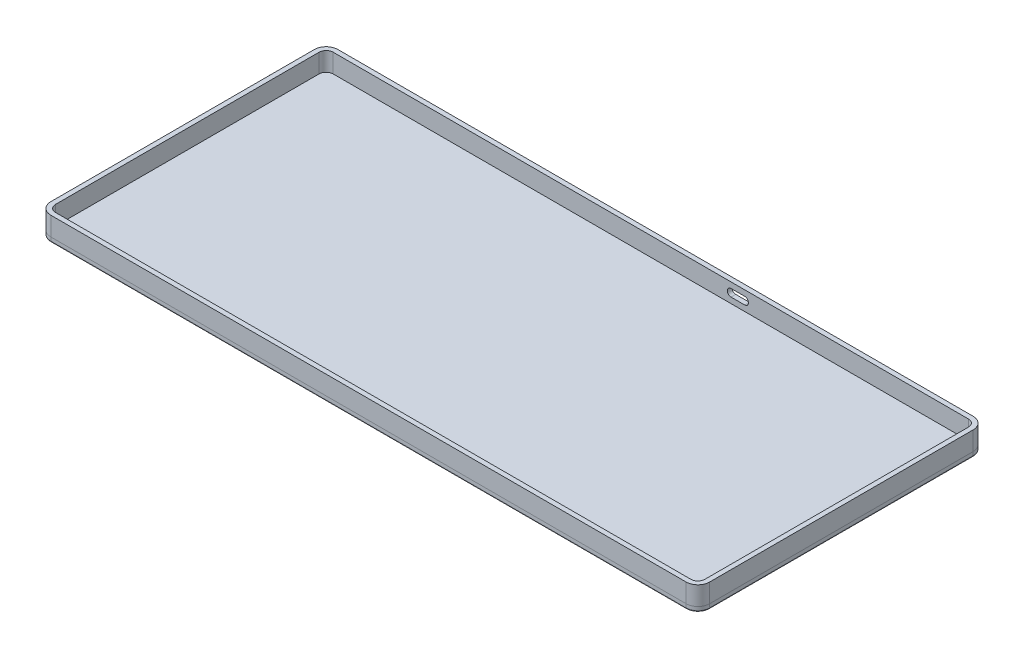
ISO-10303-21;
HEADER;
FILE_DESCRIPTION(('STEP AP214'),'2;1');
FILE_NAME('part.step','',(''),(''),'','','');
FILE_SCHEMA(('AUTOMOTIVE_DESIGN { 1 0 10303 214 1 1 1 1 }'));
ENDSEC;
DATA;
#1=APPLICATION_CONTEXT('core data for automotive mechanical design processes');
#2=APPLICATION_PROTOCOL_DEFINITION('international standard','automotive_design',2000,#1);
#3=PRODUCT_CONTEXT('',#1,'mechanical');
#4=PRODUCT('Part','Part','',(#3));
#5=PRODUCT_RELATED_PRODUCT_CATEGORY('part','',(#4));
#6=PRODUCT_DEFINITION_FORMATION('','',#4);
#7=PRODUCT_DEFINITION_CONTEXT('part definition',#1,'design');
#8=PRODUCT_DEFINITION('design','',#6,#7);
#9=PRODUCT_DEFINITION_SHAPE('','',#8);
#10=(LENGTH_UNIT() NAMED_UNIT(*) SI_UNIT(.MILLI.,.METRE.));
#11=(NAMED_UNIT(*) PLANE_ANGLE_UNIT() SI_UNIT($,.RADIAN.));
#12=(NAMED_UNIT(*) SI_UNIT($,.STERADIAN.) SOLID_ANGLE_UNIT());
#13=UNCERTAINTY_MEASURE_WITH_UNIT(LENGTH_MEASURE(1.E-05),#10,'distance_accuracy_value','');
#14=(GEOMETRIC_REPRESENTATION_CONTEXT(3) GLOBAL_UNCERTAINTY_ASSIGNED_CONTEXT((#13)) GLOBAL_UNIT_ASSIGNED_CONTEXT((#10,
#11,#12)) REPRESENTATION_CONTEXT('',''));
#15=CARTESIAN_POINT('',(0.,0.,0.));
#16=DIRECTION('',(0.,0.,1.));
#17=DIRECTION('',(1.,0.,0.));
#18=AXIS2_PLACEMENT_3D('',#15,#16,#17);
#19=CARTESIAN_POINT('',(135.,10.,-56.));
#20=DIRECTION('',(0.,1.,0.));
#21=DIRECTION('',(0.,0.,1.));
#22=AXIS2_PLACEMENT_3D('',#19,#20,#21);
#23=PLANE('',#22);
#24=CARTESIAN_POINT('',(135.,10.,-56.));
#25=DIRECTION('',(0.,1.,0.));
#26=DIRECTION('',(0.,0.,1.));
#27=AXIS2_PLACEMENT_3D('',#24,#25,#26);
#28=CIRCLE('',#27,5.);
#29=CARTESIAN_POINT('',(140.,10.,-56.));
#30=VERTEX_POINT('',#29);
#31=CARTESIAN_POINT('',(135.,10.,-61.));
#32=VERTEX_POINT('',#31);
#33=EDGE_CURVE('E276',#30,#32,#28,.T.);
#34=ORIENTED_EDGE('',*,*,#33,.T.);
#35=DIRECTION('',(-1.,0.,0.));
#36=VECTOR('',#35,1.);
#37=CARTESIAN_POINT('',(135.,10.,-61.));
#38=LINE('',#37,#36);
#39=CARTESIAN_POINT('',(-135.,10.,-61.));
#40=VERTEX_POINT('',#39);
#41=EDGE_CURVE('E279',#32,#40,#38,.T.);
#42=ORIENTED_EDGE('',*,*,#41,.T.);
#43=CARTESIAN_POINT('',(-135.,10.,-56.));
#44=DIRECTION('',(0.,1.,0.));
#45=DIRECTION('',(0.,0.,1.));
#46=AXIS2_PLACEMENT_3D('',#43,#44,#45);
#47=CIRCLE('',#46,5.);
#48=CARTESIAN_POINT('',(-140.,10.,-56.));
#49=VERTEX_POINT('',#48);
#50=EDGE_CURVE('E282',#40,#49,#47,.T.);
#51=ORIENTED_EDGE('',*,*,#50,.T.);
#52=DIRECTION('',(0.,0.,1.));
#53=VECTOR('',#52,1.);
#54=CARTESIAN_POINT('',(-140.,10.,-56.));
#55=LINE('',#54,#53);
#56=CARTESIAN_POINT('',(-140.,10.,56.));
#57=VERTEX_POINT('',#56);
#58=EDGE_CURVE('E284',#49,#57,#55,.T.);
#59=ORIENTED_EDGE('',*,*,#58,.T.);
#60=CARTESIAN_POINT('',(-135.,10.,56.));
#61=DIRECTION('',(0.,1.,0.));
#62=DIRECTION('',(0.,0.,1.));
#63=AXIS2_PLACEMENT_3D('',#60,#61,#62);
#64=CIRCLE('',#63,4.99999999999998);
#65=CARTESIAN_POINT('',(-135.,10.,61.));
#66=VERTEX_POINT('',#65);
#67=EDGE_CURVE('E286',#57,#66,#64,.T.);
#68=ORIENTED_EDGE('',*,*,#67,.T.);
#69=DIRECTION('',(1.,0.,0.));
#70=VECTOR('',#69,1.);
#71=CARTESIAN_POINT('',(-135.,10.,61.));
#72=LINE('',#71,#70);
#73=CARTESIAN_POINT('',(135.,10.,61.));
#74=VERTEX_POINT('',#73);
#75=EDGE_CURVE('E288',#66,#74,#72,.T.);
#76=ORIENTED_EDGE('',*,*,#75,.T.);
#77=CARTESIAN_POINT('',(135.,10.,56.));
#78=DIRECTION('',(0.,1.,0.));
#79=DIRECTION('',(0.,0.,1.));
#80=AXIS2_PLACEMENT_3D('',#77,#78,#79);
#81=CIRCLE('',#80,5.);
#82=CARTESIAN_POINT('',(140.,10.,56.));
#83=VERTEX_POINT('',#82);
#84=EDGE_CURVE('E290',#74,#83,#81,.T.);
#85=ORIENTED_EDGE('',*,*,#84,.T.);
#86=DIRECTION('',(0.,0.,-1.));
#87=VECTOR('',#86,1.);
#88=CARTESIAN_POINT('',(140.,10.,56.));
#89=LINE('',#88,#87);
#90=EDGE_CURVE('E292',#83,#30,#89,.T.);
#91=ORIENTED_EDGE('',*,*,#90,.T.);
#92=EDGE_LOOP('',(#34,#42,#51,#59,#68,#76,#85,#91));
#93=FACE_BOUND('',#92,.T.);
#94=DIRECTION('',(-1.,0.,0.));
#95=VECTOR('',#94,1.);
#96=CARTESIAN_POINT('',(135.,10.,-59.));
#97=LINE('',#96,#95);
#98=CARTESIAN_POINT('',(135.,10.,-59.));
#99=VERTEX_POINT('',#98);
#100=CARTESIAN_POINT('',(-135.,10.,-58.9999999999999));
#101=VERTEX_POINT('',#100);
#102=EDGE_CURVE('E219',#99,#101,#97,.T.);
#103=ORIENTED_EDGE('',*,*,#102,.F.);
#104=CARTESIAN_POINT('',(135.,10.,-56.));
#105=DIRECTION('',(0.,1.,0.));
#106=DIRECTION('',(0.,0.,1.));
#107=AXIS2_PLACEMENT_3D('',#104,#105,#106);
#108=CIRCLE('',#107,3.);
#109=CARTESIAN_POINT('',(138.,10.,-56.));
#110=VERTEX_POINT('',#109);
#111=EDGE_CURVE('E217',#110,#99,#108,.T.);
#112=ORIENTED_EDGE('',*,*,#111,.F.);
#113=DIRECTION('',(0.,0.,-1.));
#114=VECTOR('',#113,1.);
#115=CARTESIAN_POINT('',(138.,10.,56.));
#116=LINE('',#115,#114);
#117=CARTESIAN_POINT('',(138.,10.,56.));
#118=VERTEX_POINT('',#117);
#119=EDGE_CURVE('E233',#118,#110,#116,.T.);
#120=ORIENTED_EDGE('',*,*,#119,.F.);
#121=CARTESIAN_POINT('',(135.,10.,56.));
#122=DIRECTION('',(0.,1.,0.));
#123=DIRECTION('',(0.,0.,1.));
#124=AXIS2_PLACEMENT_3D('',#121,#122,#123);
#125=CIRCLE('',#124,2.99999999999999);
#126=CARTESIAN_POINT('',(135.,10.,59.));
#127=VERTEX_POINT('',#126);
#128=EDGE_CURVE('E230',#127,#118,#125,.T.);
#129=ORIENTED_EDGE('',*,*,#128,.F.);
#130=DIRECTION('',(1.,0.,0.));
#131=VECTOR('',#130,1.);
#132=CARTESIAN_POINT('',(-135.,10.,59.));
#133=LINE('',#132,#131);
#134=CARTESIAN_POINT('',(-135.,10.,59.));
#135=VERTEX_POINT('',#134);
#136=EDGE_CURVE('E228',#135,#127,#133,.T.);
#137=ORIENTED_EDGE('',*,*,#136,.F.);
#138=CARTESIAN_POINT('',(-135.,10.,56.));
#139=DIRECTION('',(0.,1.,0.));
#140=DIRECTION('',(0.,0.,1.));
#141=AXIS2_PLACEMENT_3D('',#138,#139,#140);
#142=CIRCLE('',#141,2.99999999999994);
#143=CARTESIAN_POINT('',(-138.,10.,56.));
#144=VERTEX_POINT('',#143);
#145=EDGE_CURVE('E226',#144,#135,#142,.T.);
#146=ORIENTED_EDGE('',*,*,#145,.F.);
#147=DIRECTION('',(0.,0.,1.));
#148=VECTOR('',#147,1.);
#149=CARTESIAN_POINT('',(-138.,10.,-56.));
#150=LINE('',#149,#148);
#151=CARTESIAN_POINT('',(-138.,10.,-56.));
#152=VERTEX_POINT('',#151);
#153=EDGE_CURVE('E224',#152,#144,#150,.T.);
#154=ORIENTED_EDGE('',*,*,#153,.F.);
#155=CARTESIAN_POINT('',(-135.,10.,-56.));
#156=DIRECTION('',(0.,1.,0.));
#157=DIRECTION('',(0.,0.,1.));
#158=AXIS2_PLACEMENT_3D('',#155,#156,#157);
#159=CIRCLE('',#158,2.99999999999998);
#160=EDGE_CURVE('E222',#101,#152,#159,.T.);
#161=ORIENTED_EDGE('',*,*,#160,.F.);
#162=EDGE_LOOP('',(#103,#112,#120,#129,#137,#146,#154,#161));
#163=FACE_BOUND('',#162,.T.);
#164=ADVANCED_FACE('F43',(#93,#163),#23,.T.);
#165=CARTESIAN_POINT('',(135.,2.,-56.));
#166=DIRECTION('',(0.,1.,0.));
#167=DIRECTION('',(0.,0.,1.));
#168=AXIS2_PLACEMENT_3D('',#165,#166,#167);
#169=PLANE('',#168);
#170=CARTESIAN_POINT('',(135.,2.,-56.));
#171=DIRECTION('',(0.,1.,0.));
#172=DIRECTION('',(0.,0.,1.));
#173=AXIS2_PLACEMENT_3D('',#170,#171,#172);
#174=CIRCLE('',#173,5.);
#175=CARTESIAN_POINT('',(140.,2.,-56.));
#176=VERTEX_POINT('',#175);
#177=CARTESIAN_POINT('',(135.,2.,-61.));
#178=VERTEX_POINT('',#177);
#179=EDGE_CURVE('E275',#176,#178,#174,.T.);
#180=ORIENTED_EDGE('',*,*,#179,.F.);
#181=DIRECTION('',(0.,0.,-1.));
#182=VECTOR('',#181,1.);
#183=CARTESIAN_POINT('',(140.,2.,56.));
#184=LINE('',#183,#182);
#185=CARTESIAN_POINT('',(140.,2.,56.));
#186=VERTEX_POINT('',#185);
#187=EDGE_CURVE('E280',#186,#176,#184,.T.);
#188=ORIENTED_EDGE('',*,*,#187,.F.);
#189=CARTESIAN_POINT('',(135.,2.,56.));
#190=DIRECTION('',(0.,1.,0.));
#191=DIRECTION('',(0.,0.,1.));
#192=AXIS2_PLACEMENT_3D('',#189,#190,#191);
#193=CIRCLE('',#192,5.);
#194=CARTESIAN_POINT('',(135.,2.,61.));
#195=VERTEX_POINT('',#194);
#196=EDGE_CURVE('E307',#195,#186,#193,.T.);
#197=ORIENTED_EDGE('',*,*,#196,.F.);
#198=DIRECTION('',(1.,0.,0.));
#199=VECTOR('',#198,1.);
#200=CARTESIAN_POINT('',(-135.,2.,61.));
#201=LINE('',#200,#199);
#202=CARTESIAN_POINT('',(-135.,2.,61.));
#203=VERTEX_POINT('',#202);
#204=EDGE_CURVE('E305',#203,#195,#201,.T.);
#205=ORIENTED_EDGE('',*,*,#204,.F.);
#206=CARTESIAN_POINT('',(-135.,2.,56.));
#207=DIRECTION('',(0.,1.,0.));
#208=DIRECTION('',(0.,0.,1.));
#209=AXIS2_PLACEMENT_3D('',#206,#207,#208);
#210=CIRCLE('',#209,4.99999999999998);
#211=CARTESIAN_POINT('',(-140.,2.,56.));
#212=VERTEX_POINT('',#211);
#213=EDGE_CURVE('E303',#212,#203,#210,.T.);
#214=ORIENTED_EDGE('',*,*,#213,.F.);
#215=DIRECTION('',(0.,0.,1.));
#216=VECTOR('',#215,1.);
#217=CARTESIAN_POINT('',(-140.,2.,-56.));
#218=LINE('',#217,#216);
#219=CARTESIAN_POINT('',(-140.,2.,-56.));
#220=VERTEX_POINT('',#219);
#221=EDGE_CURVE('E301',#220,#212,#218,.T.);
#222=ORIENTED_EDGE('',*,*,#221,.F.);
#223=CARTESIAN_POINT('',(-135.,2.,-56.));
#224=DIRECTION('',(0.,1.,0.));
#225=DIRECTION('',(0.,0.,1.));
#226=AXIS2_PLACEMENT_3D('',#223,#224,#225);
#227=CIRCLE('',#226,5.);
#228=CARTESIAN_POINT('',(-135.,2.,-61.));
#229=VERTEX_POINT('',#228);
#230=EDGE_CURVE('E299',#229,#220,#227,.T.);
#231=ORIENTED_EDGE('',*,*,#230,.F.);
#232=DIRECTION('',(-1.,0.,0.));
#233=VECTOR('',#232,1.);
#234=CARTESIAN_POINT('',(135.,2.,-61.));
#235=LINE('',#234,#233);
#236=EDGE_CURVE('E297',#178,#229,#235,.T.);
#237=ORIENTED_EDGE('',*,*,#236,.F.);
#238=EDGE_LOOP('',(#180,#188,#197,#205,#214,#222,#231,#237));
#239=FACE_BOUND('',#238,.T.);
#240=CARTESIAN_POINT('',(135.,2.,-56.));
#241=DIRECTION('',(0.,1.,0.));
#242=DIRECTION('',(0.,0.,1.));
#243=AXIS2_PLACEMENT_3D('',#240,#241,#242);
#244=CIRCLE('',#243,3.);
#245=CARTESIAN_POINT('',(138.,2.,-56.));
#246=VERTEX_POINT('',#245);
#247=CARTESIAN_POINT('',(135.,2.,-59.));
#248=VERTEX_POINT('',#247);
#249=EDGE_CURVE('E197',#246,#248,#244,.T.);
#250=ORIENTED_EDGE('',*,*,#249,.T.);
#251=DIRECTION('',(-1.,0.,0.));
#252=VECTOR('',#251,1.);
#253=CARTESIAN_POINT('',(135.,2.,-59.));
#254=LINE('',#253,#252);
#255=CARTESIAN_POINT('',(-135.,2.,-58.9999999999999));
#256=VERTEX_POINT('',#255);
#257=EDGE_CURVE('E238',#248,#256,#254,.T.);
#258=ORIENTED_EDGE('',*,*,#257,.T.);
#259=CARTESIAN_POINT('',(-135.,2.,-56.));
#260=DIRECTION('',(0.,1.,0.));
#261=DIRECTION('',(0.,0.,1.));
#262=AXIS2_PLACEMENT_3D('',#259,#260,#261);
#263=CIRCLE('',#262,2.99999999999998);
#264=CARTESIAN_POINT('',(-138.,2.,-56.));
#265=VERTEX_POINT('',#264);
#266=EDGE_CURVE('E241',#256,#265,#263,.T.);
#267=ORIENTED_EDGE('',*,*,#266,.T.);
#268=DIRECTION('',(0.,0.,1.));
#269=VECTOR('',#268,1.);
#270=CARTESIAN_POINT('',(-138.,2.,-56.));
#271=LINE('',#270,#269);
#272=CARTESIAN_POINT('',(-138.,2.,56.));
#273=VERTEX_POINT('',#272);
#274=EDGE_CURVE('E244',#265,#273,#271,.T.);
#275=ORIENTED_EDGE('',*,*,#274,.T.);
#276=CARTESIAN_POINT('',(-135.,2.,56.));
#277=DIRECTION('',(0.,1.,0.));
#278=DIRECTION('',(0.,0.,1.));
#279=AXIS2_PLACEMENT_3D('',#276,#277,#278);
#280=CIRCLE('',#279,2.99999999999994);
#281=CARTESIAN_POINT('',(-135.,2.,59.));
#282=VERTEX_POINT('',#281);
#283=EDGE_CURVE('E247',#273,#282,#280,.T.);
#284=ORIENTED_EDGE('',*,*,#283,.T.);
#285=DIRECTION('',(1.,0.,0.));
#286=VECTOR('',#285,1.);
#287=CARTESIAN_POINT('',(-135.,2.,59.));
#288=LINE('',#287,#286);
#289=CARTESIAN_POINT('',(135.,2.,59.));
#290=VERTEX_POINT('',#289);
#291=EDGE_CURVE('E250',#282,#290,#288,.T.);
#292=ORIENTED_EDGE('',*,*,#291,.T.);
#293=CARTESIAN_POINT('',(135.,2.,56.));
#294=DIRECTION('',(0.,1.,0.));
#295=DIRECTION('',(0.,0.,1.));
#296=AXIS2_PLACEMENT_3D('',#293,#294,#295);
#297=CIRCLE('',#296,2.99999999999999);
#298=CARTESIAN_POINT('',(138.,2.,56.));
#299=VERTEX_POINT('',#298);
#300=EDGE_CURVE('E253',#290,#299,#297,.T.);
#301=ORIENTED_EDGE('',*,*,#300,.T.);
#302=DIRECTION('',(0.,0.,-1.));
#303=VECTOR('',#302,1.);
#304=CARTESIAN_POINT('',(138.,2.,56.));
#305=LINE('',#304,#303);
#306=EDGE_CURVE('E220',#299,#246,#305,.T.);
#307=ORIENTED_EDGE('',*,*,#306,.T.);
#308=EDGE_LOOP('',(#250,#258,#267,#275,#284,#292,#301,#307));
#309=FACE_BOUND('',#308,.T.);
#310=ADVANCED_FACE('F336',(#239,#309),#169,.F.);
#311=CARTESIAN_POINT('',(135.,10.,-56.));
#312=DIRECTION('',(0.,-1.,0.));
#313=DIRECTION('',(0.,0.,-1.));
#314=AXIS2_PLACEMENT_3D('',#311,#312,#313);
#315=CYLINDRICAL_SURFACE('',#314,5.);
#316=ORIENTED_EDGE('',*,*,#179,.T.);
#317=DIRECTION('',(0.,-1.,0.));
#318=VECTOR('',#317,1.);
#319=CARTESIAN_POINT('',(135.,10.,-61.));
#320=LINE('',#319,#318);
#321=EDGE_CURVE('E12',#32,#178,#320,.T.);
#322=ORIENTED_EDGE('',*,*,#321,.F.);
#323=ORIENTED_EDGE('',*,*,#33,.F.);
#324=DIRECTION('',(0.,-1.,0.));
#325=VECTOR('',#324,1.);
#326=CARTESIAN_POINT('',(140.,10.,-56.));
#327=LINE('',#326,#325);
#328=EDGE_CURVE('E294',#30,#176,#327,.T.);
#329=ORIENTED_EDGE('',*,*,#328,.T.);
#330=EDGE_LOOP('',(#316,#322,#323,#329));
#331=FACE_BOUND('',#330,.T.);
#332=ADVANCED_FACE('F45',(#331),#315,.T.);
#333=CARTESIAN_POINT('',(135.,10.,-61.));
#334=DIRECTION('',(0.,0.,1.));
#335=DIRECTION('',(1.,0.,0.));
#336=AXIS2_PLACEMENT_3D('',#333,#334,#335);
#337=PLANE('',#336);
#338=DIRECTION('',(1.,0.,0.));
#339=VECTOR('',#338,1.);
#340=CARTESIAN_POINT('',(39.915,7.585,-61.));
#341=LINE('',#340,#339);
#342=CARTESIAN_POINT('',(34.085,7.585,-61.));
#343=VERTEX_POINT('',#342);
#344=CARTESIAN_POINT('',(39.915,7.585,-61.));
#345=VERTEX_POINT('',#344);
#346=EDGE_CURVE('E203',#343,#345,#341,.T.);
#347=ORIENTED_EDGE('',*,*,#346,.F.);
#348=CARTESIAN_POINT('',(34.085,6.,-61.));
#349=DIRECTION('',(0.,0.,-1.));
#350=DIRECTION('',(1.,0.,0.));
#351=AXIS2_PLACEMENT_3D('',#348,#349,#350);
#352=CIRCLE('',#351,1.585);
#353=CARTESIAN_POINT('',(34.085,4.415,-61.));
#354=VERTEX_POINT('',#353);
#355=EDGE_CURVE('E58',#354,#343,#352,.T.);
#356=ORIENTED_EDGE('',*,*,#355,.F.);
#357=DIRECTION('',(-1.,0.,0.));
#358=VECTOR('',#357,1.);
#359=CARTESIAN_POINT('',(34.085,4.415,-61.));
#360=LINE('',#359,#358);
#361=CARTESIAN_POINT('',(39.915,4.415,-61.));
#362=VERTEX_POINT('',#361);
#363=EDGE_CURVE('E190',#362,#354,#360,.T.);
#364=ORIENTED_EDGE('',*,*,#363,.F.);
#365=CARTESIAN_POINT('',(39.915,6.,-61.));
#366=DIRECTION('',(0.,0.,-1.));
#367=DIRECTION('',(-1.,0.,0.));
#368=AXIS2_PLACEMENT_3D('',#365,#366,#367);
#369=CIRCLE('',#368,1.585);
#370=EDGE_CURVE('E198',#345,#362,#369,.T.);
#371=ORIENTED_EDGE('',*,*,#370,.F.);
#372=EDGE_LOOP('',(#347,#356,#364,#371));
#373=FACE_BOUND('',#372,.T.);
#374=ORIENTED_EDGE('',*,*,#236,.T.);
#375=DIRECTION('',(0.,-1.,0.));
#376=VECTOR('',#375,1.);
#377=CARTESIAN_POINT('',(-135.,10.,-61.));
#378=LINE('',#377,#376);
#379=EDGE_CURVE('E51',#40,#229,#378,.T.);
#380=ORIENTED_EDGE('',*,*,#379,.F.);
#381=ORIENTED_EDGE('',*,*,#41,.F.);
#382=ORIENTED_EDGE('',*,*,#321,.T.);
#383=EDGE_LOOP('',(#374,#380,#381,#382));
#384=FACE_BOUND('',#383,.T.);
#385=ADVANCED_FACE('F201',(#373,#384),#337,.F.);
#386=CARTESIAN_POINT('',(-135.,10.,-56.));
#387=DIRECTION('',(0.,-1.,0.));
#388=DIRECTION('',(0.,0.,-1.));
#389=AXIS2_PLACEMENT_3D('',#386,#387,#388);
#390=CYLINDRICAL_SURFACE('',#389,5.);
#391=ORIENTED_EDGE('',*,*,#230,.T.);
#392=DIRECTION('',(0.,-1.,0.));
#393=VECTOR('',#392,1.);
#394=CARTESIAN_POINT('',(-140.,10.,-56.));
#395=LINE('',#394,#393);
#396=EDGE_CURVE('E324',#49,#220,#395,.T.);
#397=ORIENTED_EDGE('',*,*,#396,.F.);
#398=ORIENTED_EDGE('',*,*,#50,.F.);
#399=ORIENTED_EDGE('',*,*,#379,.T.);
#400=EDGE_LOOP('',(#391,#397,#398,#399));
#401=FACE_BOUND('',#400,.T.);
#402=ADVANCED_FACE('F331',(#401),#390,.T.);
#403=CARTESIAN_POINT('',(-140.,10.,-56.));
#404=DIRECTION('',(1.,0.,0.));
#405=DIRECTION('',(0.,0.,-1.));
#406=AXIS2_PLACEMENT_3D('',#403,#404,#405);
#407=PLANE('',#406);
#408=ORIENTED_EDGE('',*,*,#221,.T.);
#409=DIRECTION('',(0.,-1.,0.));
#410=VECTOR('',#409,1.);
#411=CARTESIAN_POINT('',(-140.,10.,56.));
#412=LINE('',#411,#410);
#413=EDGE_CURVE('E321',#57,#212,#412,.T.);
#414=ORIENTED_EDGE('',*,*,#413,.F.);
#415=ORIENTED_EDGE('',*,*,#58,.F.);
#416=ORIENTED_EDGE('',*,*,#396,.T.);
#417=EDGE_LOOP('',(#408,#414,#415,#416));
#418=FACE_BOUND('',#417,.T.);
#419=ADVANCED_FACE('F342',(#418),#407,.F.);
#420=CARTESIAN_POINT('',(-135.,10.,56.));
#421=DIRECTION('',(0.,-1.,0.));
#422=DIRECTION('',(0.,0.,-1.));
#423=AXIS2_PLACEMENT_3D('',#420,#421,#422);
#424=CYLINDRICAL_SURFACE('',#423,4.99999999999998);
#425=ORIENTED_EDGE('',*,*,#213,.T.);
#426=DIRECTION('',(0.,-1.,0.));
#427=VECTOR('',#426,1.);
#428=CARTESIAN_POINT('',(-135.,10.,61.));
#429=LINE('',#428,#427);
#430=EDGE_CURVE('E318',#66,#203,#429,.T.);
#431=ORIENTED_EDGE('',*,*,#430,.F.);
#432=ORIENTED_EDGE('',*,*,#67,.F.);
#433=ORIENTED_EDGE('',*,*,#413,.T.);
#434=EDGE_LOOP('',(#425,#431,#432,#433));
#435=FACE_BOUND('',#434,.T.);
#436=ADVANCED_FACE('F346',(#435),#424,.T.);
#437=CARTESIAN_POINT('',(-135.,10.,61.));
#438=DIRECTION('',(0.,0.,-1.));
#439=DIRECTION('',(-1.,0.,0.));
#440=AXIS2_PLACEMENT_3D('',#437,#438,#439);
#441=PLANE('',#440);
#442=ORIENTED_EDGE('',*,*,#204,.T.);
#443=DIRECTION('',(0.,-1.,0.));
#444=VECTOR('',#443,1.);
#445=CARTESIAN_POINT('',(135.,10.,61.));
#446=LINE('',#445,#444);
#447=EDGE_CURVE('E315',#74,#195,#446,.T.);
#448=ORIENTED_EDGE('',*,*,#447,.F.);
#449=ORIENTED_EDGE('',*,*,#75,.F.);
#450=ORIENTED_EDGE('',*,*,#430,.T.);
#451=EDGE_LOOP('',(#442,#448,#449,#450));
#452=FACE_BOUND('',#451,.T.);
#453=ADVANCED_FACE('F366',(#452),#441,.F.);
#454=CARTESIAN_POINT('',(135.,10.,56.));
#455=DIRECTION('',(0.,-1.,0.));
#456=DIRECTION('',(0.,0.,-1.));
#457=AXIS2_PLACEMENT_3D('',#454,#455,#456);
#458=CYLINDRICAL_SURFACE('',#457,5.);
#459=ORIENTED_EDGE('',*,*,#196,.T.);
#460=DIRECTION('',(0.,-1.,0.));
#461=VECTOR('',#460,1.);
#462=CARTESIAN_POINT('',(140.,10.,56.));
#463=LINE('',#462,#461);
#464=EDGE_CURVE('E312',#83,#186,#463,.T.);
#465=ORIENTED_EDGE('',*,*,#464,.F.);
#466=ORIENTED_EDGE('',*,*,#84,.F.);
#467=ORIENTED_EDGE('',*,*,#447,.T.);
#468=EDGE_LOOP('',(#459,#465,#466,#467));
#469=FACE_BOUND('',#468,.T.);
#470=ADVANCED_FACE('F364',(#469),#458,.T.);
#471=CARTESIAN_POINT('',(140.,10.,56.));
#472=DIRECTION('',(-1.,0.,0.));
#473=DIRECTION('',(0.,0.,1.));
#474=AXIS2_PLACEMENT_3D('',#471,#472,#473);
#475=PLANE('',#474);
#476=ORIENTED_EDGE('',*,*,#187,.T.);
#477=ORIENTED_EDGE('',*,*,#328,.F.);
#478=ORIENTED_EDGE('',*,*,#90,.F.);
#479=ORIENTED_EDGE('',*,*,#464,.T.);
#480=EDGE_LOOP('',(#476,#477,#478,#479));
#481=FACE_BOUND('',#480,.T.);
#482=ADVANCED_FACE('F359',(#481),#475,.F.);
#483=CARTESIAN_POINT('',(135.,10.,-56.));
#484=DIRECTION('',(0.,-1.,0.));
#485=DIRECTION('',(0.,0.,-1.));
#486=AXIS2_PLACEMENT_3D('',#483,#484,#485);
#487=CYLINDRICAL_SURFACE('',#486,3.);
#488=ORIENTED_EDGE('',*,*,#249,.F.);
#489=DIRECTION('',(0.,-1.,0.));
#490=VECTOR('',#489,1.);
#491=CARTESIAN_POINT('',(138.,10.,-56.));
#492=LINE('',#491,#490);
#493=EDGE_CURVE('E235',#110,#246,#492,.T.);
#494=ORIENTED_EDGE('',*,*,#493,.F.);
#495=ORIENTED_EDGE('',*,*,#111,.T.);
#496=DIRECTION('',(0.,-1.,0.));
#497=VECTOR('',#496,1.);
#498=CARTESIAN_POINT('',(135.,10.,-59.));
#499=LINE('',#498,#497);
#500=EDGE_CURVE('E272',#99,#248,#499,.T.);
#501=ORIENTED_EDGE('',*,*,#500,.T.);
#502=EDGE_LOOP('',(#488,#494,#495,#501));
#503=FACE_BOUND('',#502,.T.);
#504=ADVANCED_FACE('F382',(#503),#487,.F.);
#505=CARTESIAN_POINT('',(135.,10.,-59.));
#506=DIRECTION('',(0.,0.,1.));
#507=DIRECTION('',(1.,0.,0.));
#508=AXIS2_PLACEMENT_3D('',#505,#506,#507);
#509=PLANE('',#508);
#510=CARTESIAN_POINT('',(34.085,6.,-59.));
#511=DIRECTION('',(0.,0.,1.));
#512=DIRECTION('',(1.,0.,0.));
#513=AXIS2_PLACEMENT_3D('',#510,#511,#512);
#514=CIRCLE('',#513,1.585);
#515=CARTESIAN_POINT('',(34.085,4.415,-59.));
#516=VERTEX_POINT('',#515);
#517=CARTESIAN_POINT('',(34.085,7.585,-59.));
#518=VERTEX_POINT('',#517);
#519=EDGE_CURVE('E183',#516,#518,#514,.F.);
#520=ORIENTED_EDGE('',*,*,#519,.T.);
#521=DIRECTION('',(1.,0.,0.));
#522=VECTOR('',#521,1.);
#523=CARTESIAN_POINT('',(39.915,7.585,-59.));
#524=LINE('',#523,#522);
#525=CARTESIAN_POINT('',(39.915,7.585,-59.));
#526=VERTEX_POINT('',#525);
#527=EDGE_CURVE('E206',#518,#526,#524,.T.);
#528=ORIENTED_EDGE('',*,*,#527,.T.);
#529=CARTESIAN_POINT('',(39.915,6.,-59.));
#530=DIRECTION('',(0.,0.,1.));
#531=DIRECTION('',(1.,0.,0.));
#532=AXIS2_PLACEMENT_3D('',#529,#530,#531);
#533=CIRCLE('',#532,1.585);
#534=CARTESIAN_POINT('',(39.915,4.415,-59.));
#535=VERTEX_POINT('',#534);
#536=EDGE_CURVE('E186',#526,#535,#533,.F.);
#537=ORIENTED_EDGE('',*,*,#536,.T.);
#538=DIRECTION('',(-1.,0.,0.));
#539=VECTOR('',#538,1.);
#540=CARTESIAN_POINT('',(34.085,4.415,-59.));
#541=LINE('',#540,#539);
#542=EDGE_CURVE('E187',#535,#516,#541,.T.);
#543=ORIENTED_EDGE('',*,*,#542,.T.);
#544=EDGE_LOOP('',(#520,#528,#537,#543));
#545=FACE_BOUND('',#544,.T.);
#546=ORIENTED_EDGE('',*,*,#257,.F.);
#547=ORIENTED_EDGE('',*,*,#500,.F.);
#548=ORIENTED_EDGE('',*,*,#102,.T.);
#549=DIRECTION('',(0.,-1.,0.));
#550=VECTOR('',#549,1.);
#551=CARTESIAN_POINT('',(-135.,10.,-58.9999999999999));
#552=LINE('',#551,#550);
#553=EDGE_CURVE('E270',#101,#256,#552,.T.);
#554=ORIENTED_EDGE('',*,*,#553,.T.);
#555=EDGE_LOOP('',(#546,#547,#548,#554));
#556=FACE_BOUND('',#555,.T.);
#557=ADVANCED_FACE('F389',(#545,#556),#509,.T.);
#558=CARTESIAN_POINT('',(-135.,10.,-56.));
#559=DIRECTION('',(0.,-1.,0.));
#560=DIRECTION('',(0.,0.,-1.));
#561=AXIS2_PLACEMENT_3D('',#558,#559,#560);
#562=CYLINDRICAL_SURFACE('',#561,2.99999999999998);
#563=ORIENTED_EDGE('',*,*,#266,.F.);
#564=ORIENTED_EDGE('',*,*,#553,.F.);
#565=ORIENTED_EDGE('',*,*,#160,.T.);
#566=DIRECTION('',(0.,-1.,0.));
#567=VECTOR('',#566,1.);
#568=CARTESIAN_POINT('',(-138.,10.,-56.));
#569=LINE('',#568,#567);
#570=EDGE_CURVE('E268',#152,#265,#569,.T.);
#571=ORIENTED_EDGE('',*,*,#570,.T.);
#572=EDGE_LOOP('',(#563,#564,#565,#571));
#573=FACE_BOUND('',#572,.T.);
#574=ADVANCED_FACE('F394',(#573),#562,.F.);
#575=CARTESIAN_POINT('',(-138.,10.,-56.));
#576=DIRECTION('',(1.,0.,0.));
#577=DIRECTION('',(0.,0.,-1.));
#578=AXIS2_PLACEMENT_3D('',#575,#576,#577);
#579=PLANE('',#578);
#580=ORIENTED_EDGE('',*,*,#274,.F.);
#581=ORIENTED_EDGE('',*,*,#570,.F.);
#582=ORIENTED_EDGE('',*,*,#153,.T.);
#583=DIRECTION('',(0.,-1.,0.));
#584=VECTOR('',#583,1.);
#585=CARTESIAN_POINT('',(-138.,10.,56.));
#586=LINE('',#585,#584);
#587=EDGE_CURVE('E266',#144,#273,#586,.T.);
#588=ORIENTED_EDGE('',*,*,#587,.T.);
#589=EDGE_LOOP('',(#580,#581,#582,#588));
#590=FACE_BOUND('',#589,.T.);
#591=ADVANCED_FACE('F420',(#590),#579,.T.);
#592=CARTESIAN_POINT('',(-135.,10.,56.));
#593=DIRECTION('',(0.,-1.,0.));
#594=DIRECTION('',(0.,0.,-1.));
#595=AXIS2_PLACEMENT_3D('',#592,#593,#594);
#596=CYLINDRICAL_SURFACE('',#595,2.99999999999994);
#597=ORIENTED_EDGE('',*,*,#283,.F.);
#598=ORIENTED_EDGE('',*,*,#587,.F.);
#599=ORIENTED_EDGE('',*,*,#145,.T.);
#600=DIRECTION('',(0.,-1.,0.));
#601=VECTOR('',#600,1.);
#602=CARTESIAN_POINT('',(-135.,10.,59.));
#603=LINE('',#602,#601);
#604=EDGE_CURVE('E264',#135,#282,#603,.T.);
#605=ORIENTED_EDGE('',*,*,#604,.T.);
#606=EDGE_LOOP('',(#597,#598,#599,#605));
#607=FACE_BOUND('',#606,.T.);
#608=ADVANCED_FACE('F425',(#607),#596,.F.);
#609=CARTESIAN_POINT('',(-135.,10.,59.));
#610=DIRECTION('',(0.,0.,-1.));
#611=DIRECTION('',(-1.,0.,0.));
#612=AXIS2_PLACEMENT_3D('',#609,#610,#611);
#613=PLANE('',#612);
#614=ORIENTED_EDGE('',*,*,#291,.F.);
#615=ORIENTED_EDGE('',*,*,#604,.F.);
#616=ORIENTED_EDGE('',*,*,#136,.T.);
#617=DIRECTION('',(0.,-1.,0.));
#618=VECTOR('',#617,1.);
#619=CARTESIAN_POINT('',(135.,10.,59.));
#620=LINE('',#619,#618);
#621=EDGE_CURVE('E262',#127,#290,#620,.T.);
#622=ORIENTED_EDGE('',*,*,#621,.T.);
#623=EDGE_LOOP('',(#614,#615,#616,#622));
#624=FACE_BOUND('',#623,.T.);
#625=ADVANCED_FACE('F428',(#624),#613,.T.);
#626=CARTESIAN_POINT('',(135.,10.,56.));
#627=DIRECTION('',(0.,-1.,0.));
#628=DIRECTION('',(0.,0.,-1.));
#629=AXIS2_PLACEMENT_3D('',#626,#627,#628);
#630=CYLINDRICAL_SURFACE('',#629,2.99999999999999);
#631=ORIENTED_EDGE('',*,*,#300,.F.);
#632=ORIENTED_EDGE('',*,*,#621,.F.);
#633=ORIENTED_EDGE('',*,*,#128,.T.);
#634=DIRECTION('',(0.,-1.,0.));
#635=VECTOR('',#634,1.);
#636=CARTESIAN_POINT('',(138.,10.,56.));
#637=LINE('',#636,#635);
#638=EDGE_CURVE('E260',#118,#299,#637,.T.);
#639=ORIENTED_EDGE('',*,*,#638,.T.);
#640=EDGE_LOOP('',(#631,#632,#633,#639));
#641=FACE_BOUND('',#640,.T.);
#642=ADVANCED_FACE('F407',(#641),#630,.F.);
#643=CARTESIAN_POINT('',(138.,10.,56.));
#644=DIRECTION('',(-1.,0.,0.));
#645=DIRECTION('',(0.,0.,1.));
#646=AXIS2_PLACEMENT_3D('',#643,#644,#645);
#647=PLANE('',#646);
#648=ORIENTED_EDGE('',*,*,#306,.F.);
#649=ORIENTED_EDGE('',*,*,#638,.F.);
#650=ORIENTED_EDGE('',*,*,#119,.T.);
#651=ORIENTED_EDGE('',*,*,#493,.T.);
#652=EDGE_LOOP('',(#648,#649,#650,#651));
#653=FACE_BOUND('',#652,.T.);
#654=ADVANCED_FACE('F401',(#653),#647,.T.);
#655=CARTESIAN_POINT('',(34.085,6.,61.001));
#656=DIRECTION('',(0.,0.,-1.));
#657=DIRECTION('',(-1.,0.,0.));
#658=AXIS2_PLACEMENT_3D('',#655,#656,#657);
#659=CYLINDRICAL_SURFACE('',#658,1.585);
#660=DIRECTION('',(0.,0.,-1.));
#661=VECTOR('',#660,1.);
#662=CARTESIAN_POINT('',(34.085,4.415,61.001));
#663=LINE('',#662,#661);
#664=EDGE_CURVE('E179',#516,#354,#663,.T.);
#665=ORIENTED_EDGE('',*,*,#664,.T.);
#666=ORIENTED_EDGE('',*,*,#355,.T.);
#667=DIRECTION('',(0.,0.,-1.));
#668=VECTOR('',#667,1.);
#669=CARTESIAN_POINT('',(34.085,7.585,61.001));
#670=LINE('',#669,#668);
#671=EDGE_CURVE('E211',#518,#343,#670,.T.);
#672=ORIENTED_EDGE('',*,*,#671,.F.);
#673=ORIENTED_EDGE('',*,*,#519,.F.);
#674=EDGE_LOOP('',(#665,#666,#672,#673));
#675=FACE_BOUND('',#674,.T.);
#676=ADVANCED_FACE('F181',(#675),#659,.F.);
#677=CARTESIAN_POINT('',(34.085,4.415,61.001));
#678=DIRECTION('',(0.,-1.,0.));
#679=DIRECTION('',(0.,0.,-1.));
#680=AXIS2_PLACEMENT_3D('',#677,#678,#679);
#681=PLANE('',#680);
#682=DIRECTION('',(0.,0.,-1.));
#683=VECTOR('',#682,1.);
#684=CARTESIAN_POINT('',(39.915,4.415,61.001));
#685=LINE('',#684,#683);
#686=EDGE_CURVE('E193',#535,#362,#685,.T.);
#687=ORIENTED_EDGE('',*,*,#686,.T.);
#688=ORIENTED_EDGE('',*,*,#363,.T.);
#689=ORIENTED_EDGE('',*,*,#664,.F.);
#690=ORIENTED_EDGE('',*,*,#542,.F.);
#691=EDGE_LOOP('',(#687,#688,#689,#690));
#692=FACE_BOUND('',#691,.T.);
#693=ADVANCED_FACE('F191',(#692),#681,.F.);
#694=CARTESIAN_POINT('',(39.915,6.,61.001));
#695=DIRECTION('',(0.,0.,-1.));
#696=DIRECTION('',(-1.,0.,0.));
#697=AXIS2_PLACEMENT_3D('',#694,#695,#696);
#698=CYLINDRICAL_SURFACE('',#697,1.585);
#699=DIRECTION('',(0.,0.,-1.));
#700=VECTOR('',#699,1.);
#701=CARTESIAN_POINT('',(39.915,7.585,61.001));
#702=LINE('',#701,#700);
#703=EDGE_CURVE('E66',#526,#345,#702,.T.);
#704=ORIENTED_EDGE('',*,*,#703,.T.);
#705=ORIENTED_EDGE('',*,*,#370,.T.);
#706=ORIENTED_EDGE('',*,*,#686,.F.);
#707=ORIENTED_EDGE('',*,*,#536,.F.);
#708=EDGE_LOOP('',(#704,#705,#706,#707));
#709=FACE_BOUND('',#708,.T.);
#710=ADVANCED_FACE('F504',(#709),#698,.F.);
#711=CARTESIAN_POINT('',(39.915,7.585,61.001));
#712=DIRECTION('',(0.,1.,0.));
#713=DIRECTION('',(0.,0.,1.));
#714=AXIS2_PLACEMENT_3D('',#711,#712,#713);
#715=PLANE('',#714);
#716=ORIENTED_EDGE('',*,*,#671,.T.);
#717=ORIENTED_EDGE('',*,*,#346,.T.);
#718=ORIENTED_EDGE('',*,*,#703,.F.);
#719=ORIENTED_EDGE('',*,*,#527,.F.);
#720=EDGE_LOOP('',(#716,#717,#718,#719));
#721=FACE_BOUND('',#720,.T.);
#722=ADVANCED_FACE('F513',(#721),#715,.F.);
#723=CLOSED_SHELL('',(#164,#310,#332,#385,#402,#419,#436,#453,#470,#482,#504,#557,#574,#591,
#608,#625,#642,#654,#676,#693,#710,#722));
#724=MANIFOLD_SOLID_BREP('B2',#723);
#725=CARTESIAN_POINT('',(135.,2.,-56.));
#726=DIRECTION('',(0.,-1.,0.));
#727=DIRECTION('',(0.,0.,-1.));
#728=AXIS2_PLACEMENT_3D('',#725,#726,#727);
#729=CYLINDRICAL_SURFACE('',#728,5.);
#730=DIRECTION('',(0.,-1.,0.));
#731=VECTOR('',#730,1.);
#732=CARTESIAN_POINT('',(140.,2.,-56.));
#733=LINE('',#732,#731);
#734=CARTESIAN_POINT('',(140.,2.,-56.));
#735=VERTEX_POINT('',#734);
#736=CARTESIAN_POINT('',(140.,0.5,-56.));
#737=VERTEX_POINT('',#736);
#738=EDGE_CURVE('E796',#735,#737,#733,.T.);
#739=ORIENTED_EDGE('',*,*,#738,.T.);
#740=CARTESIAN_POINT('',(135.,0.5,-56.));
#741=DIRECTION('',(0.,-1.,0.));
#742=DIRECTION('',(0.,0.,-1.));
#743=AXIS2_PLACEMENT_3D('',#740,#741,#742);
#744=CIRCLE('',#743,5.);
#745=CARTESIAN_POINT('',(135.,0.5,-61.));
#746=VERTEX_POINT('',#745);
#747=EDGE_CURVE('E41',#737,#746,#744,.F.);
#748=ORIENTED_EDGE('',*,*,#747,.T.);
#749=DIRECTION('',(0.,-1.,0.));
#750=VECTOR('',#749,1.);
#751=CARTESIAN_POINT('',(135.,2.,-61.));
#752=LINE('',#751,#750);
#753=CARTESIAN_POINT('',(135.,2.,-61.));
#754=VERTEX_POINT('',#753);
#755=EDGE_CURVE('E684',#754,#746,#752,.T.);
#756=ORIENTED_EDGE('',*,*,#755,.F.);
#757=CARTESIAN_POINT('',(135.,2.,-56.));
#758=DIRECTION('',(0.,1.,0.));
#759=DIRECTION('',(0.,0.,-1.));
#760=AXIS2_PLACEMENT_3D('',#757,#758,#759);
#761=CIRCLE('',#760,5.);
#762=EDGE_CURVE('E691',#735,#754,#761,.T.);
#763=ORIENTED_EDGE('',*,*,#762,.F.);
#764=EDGE_LOOP('',(#739,#748,#756,#763));
#765=FACE_BOUND('',#764,.T.);
#766=ADVANCED_FACE('F587',(#765),#729,.T.);
#767=CARTESIAN_POINT('',(-135.,2.,-61.));
#768=DIRECTION('',(0.,0.,1.));
#769=DIRECTION('',(1.,0.,0.));
#770=AXIS2_PLACEMENT_3D('',#767,#768,#769);
#771=PLANE('',#770);
#772=ORIENTED_EDGE('',*,*,#755,.T.);
#773=DIRECTION('',(-1.,0.,0.));
#774=VECTOR('',#773,1.);
#775=CARTESIAN_POINT('',(-135.,0.5,-61.));
#776=LINE('',#775,#774);
#777=CARTESIAN_POINT('',(-135.,0.5,-61.));
#778=VERTEX_POINT('',#777);
#779=EDGE_CURVE('E700',#746,#778,#776,.T.);
#780=ORIENTED_EDGE('',*,*,#779,.T.);
#781=DIRECTION('',(0.,-1.,0.));
#782=VECTOR('',#781,1.);
#783=CARTESIAN_POINT('',(-135.,2.,-61.));
#784=LINE('',#783,#782);
#785=CARTESIAN_POINT('',(-135.,2.,-61.));
#786=VERTEX_POINT('',#785);
#787=EDGE_CURVE('E687',#786,#778,#784,.T.);
#788=ORIENTED_EDGE('',*,*,#787,.F.);
#789=DIRECTION('',(-1.,0.,0.));
#790=VECTOR('',#789,1.);
#791=CARTESIAN_POINT('',(-135.,2.,-61.));
#792=LINE('',#791,#790);
#793=EDGE_CURVE('E679',#754,#786,#792,.T.);
#794=ORIENTED_EDGE('',*,*,#793,.F.);
#795=EDGE_LOOP('',(#772,#780,#788,#794));
#796=FACE_BOUND('',#795,.T.);
#797=ADVANCED_FACE('F681',(#796),#771,.F.);
#798=CARTESIAN_POINT('',(-135.,2.,-56.));
#799=DIRECTION('',(0.,-1.,0.));
#800=DIRECTION('',(0.,0.,-1.));
#801=AXIS2_PLACEMENT_3D('',#798,#799,#800);
#802=CYLINDRICAL_SURFACE('',#801,5.00000000000002);
#803=ORIENTED_EDGE('',*,*,#787,.T.);
#804=CARTESIAN_POINT('',(-135.,0.5,-56.));
#805=DIRECTION('',(0.,-1.,0.));
#806=DIRECTION('',(0.,0.,-1.));
#807=AXIS2_PLACEMENT_3D('',#804,#805,#806);
#808=CIRCLE('',#807,5.00000000000002);
#809=CARTESIAN_POINT('',(-140.,0.5,-56.));
#810=VERTEX_POINT('',#809);
#811=EDGE_CURVE('E724',#778,#810,#808,.F.);
#812=ORIENTED_EDGE('',*,*,#811,.T.);
#813=DIRECTION('',(0.,-1.,0.));
#814=VECTOR('',#813,1.);
#815=CARTESIAN_POINT('',(-140.,2.,-56.));
#816=LINE('',#815,#814);
#817=CARTESIAN_POINT('',(-140.,2.,-56.));
#818=VERTEX_POINT('',#817);
#819=EDGE_CURVE('E704',#818,#810,#816,.T.);
#820=ORIENTED_EDGE('',*,*,#819,.F.);
#821=CARTESIAN_POINT('',(-135.,2.,-56.));
#822=DIRECTION('',(0.,1.,0.));
#823=DIRECTION('',(0.,0.,1.));
#824=AXIS2_PLACEMENT_3D('',#821,#822,#823);
#825=CIRCLE('',#824,5.00000000000002);
#826=EDGE_CURVE('E690',#786,#818,#825,.T.);
#827=ORIENTED_EDGE('',*,*,#826,.F.);
#828=EDGE_LOOP('',(#803,#812,#820,#827));
#829=FACE_BOUND('',#828,.T.);
#830=ADVANCED_FACE('F781',(#829),#802,.T.);
#831=CARTESIAN_POINT('',(-140.,2.,-56.));
#832=DIRECTION('',(1.,0.,0.));
#833=DIRECTION('',(0.,0.,-1.));
#834=AXIS2_PLACEMENT_3D('',#831,#832,#833);
#835=PLANE('',#834);
#836=ORIENTED_EDGE('',*,*,#819,.T.);
#837=DIRECTION('',(0.,0.,1.));
#838=VECTOR('',#837,1.);
#839=CARTESIAN_POINT('',(-140.,0.5,56.));
#840=LINE('',#839,#838);
#841=CARTESIAN_POINT('',(-140.,0.5,56.));
#842=VERTEX_POINT('',#841);
#843=EDGE_CURVE('E726',#810,#842,#840,.T.);
#844=ORIENTED_EDGE('',*,*,#843,.T.);
#845=DIRECTION('',(0.,-1.,0.));
#846=VECTOR('',#845,1.);
#847=CARTESIAN_POINT('',(-140.,2.,56.));
#848=LINE('',#847,#846);
#849=CARTESIAN_POINT('',(-140.,2.,56.));
#850=VERTEX_POINT('',#849);
#851=EDGE_CURVE('E805',#850,#842,#848,.T.);
#852=ORIENTED_EDGE('',*,*,#851,.F.);
#853=DIRECTION('',(0.,0.,1.));
#854=VECTOR('',#853,1.);
#855=CARTESIAN_POINT('',(-140.,2.,-56.));
#856=LINE('',#855,#854);
#857=EDGE_CURVE('E785',#818,#850,#856,.T.);
#858=ORIENTED_EDGE('',*,*,#857,.F.);
#859=EDGE_LOOP('',(#836,#844,#852,#858));
#860=FACE_BOUND('',#859,.T.);
#861=ADVANCED_FACE('F809',(#860),#835,.F.);
#862=CARTESIAN_POINT('',(-135.,2.,56.));
#863=DIRECTION('',(0.,-1.,0.));
#864=DIRECTION('',(0.,0.,-1.));
#865=AXIS2_PLACEMENT_3D('',#862,#863,#864);
#866=CYLINDRICAL_SURFACE('',#865,4.99999999999999);
#867=ORIENTED_EDGE('',*,*,#851,.T.);
#868=CARTESIAN_POINT('',(-135.,0.5,56.));
#869=DIRECTION('',(0.,-1.,0.));
#870=DIRECTION('',(0.,0.,-1.));
#871=AXIS2_PLACEMENT_3D('',#868,#869,#870);
#872=CIRCLE('',#871,4.99999999999999);
#873=CARTESIAN_POINT('',(-135.,0.5,61.));
#874=VERTEX_POINT('',#873);
#875=EDGE_CURVE('E728',#842,#874,#872,.F.);
#876=ORIENTED_EDGE('',*,*,#875,.T.);
#877=DIRECTION('',(0.,-1.,0.));
#878=VECTOR('',#877,1.);
#879=CARTESIAN_POINT('',(-135.,2.,61.));
#880=LINE('',#879,#878);
#881=CARTESIAN_POINT('',(-135.,2.,61.));
#882=VERTEX_POINT('',#881);
#883=EDGE_CURVE('E802',#882,#874,#880,.T.);
#884=ORIENTED_EDGE('',*,*,#883,.F.);
#885=CARTESIAN_POINT('',(-135.,2.,56.));
#886=DIRECTION('',(0.,1.,0.));
#887=DIRECTION('',(0.,0.,1.));
#888=AXIS2_PLACEMENT_3D('',#885,#886,#887);
#889=CIRCLE('',#888,4.99999999999999);
#890=EDGE_CURVE('E787',#850,#882,#889,.T.);
#891=ORIENTED_EDGE('',*,*,#890,.F.);
#892=EDGE_LOOP('',(#867,#876,#884,#891));
#893=FACE_BOUND('',#892,.T.);
#894=ADVANCED_FACE('F837',(#893),#866,.T.);
#895=CARTESIAN_POINT('',(-135.,2.,61.));
#896=DIRECTION('',(0.,0.,-1.));
#897=DIRECTION('',(-1.,0.,0.));
#898=AXIS2_PLACEMENT_3D('',#895,#896,#897);
#899=PLANE('',#898);
#900=ORIENTED_EDGE('',*,*,#883,.T.);
#901=DIRECTION('',(1.,0.,0.));
#902=VECTOR('',#901,1.);
#903=CARTESIAN_POINT('',(135.,0.5,61.));
#904=LINE('',#903,#902);
#905=CARTESIAN_POINT('',(135.,0.5,61.));
#906=VERTEX_POINT('',#905);
#907=EDGE_CURVE('E730',#874,#906,#904,.T.);
#908=ORIENTED_EDGE('',*,*,#907,.T.);
#909=DIRECTION('',(0.,-1.,0.));
#910=VECTOR('',#909,1.);
#911=CARTESIAN_POINT('',(135.,2.,61.));
#912=LINE('',#911,#910);
#913=CARTESIAN_POINT('',(135.,2.,61.));
#914=VERTEX_POINT('',#913);
#915=EDGE_CURVE('E800',#914,#906,#912,.T.);
#916=ORIENTED_EDGE('',*,*,#915,.F.);
#917=DIRECTION('',(1.,0.,0.));
#918=VECTOR('',#917,1.);
#919=CARTESIAN_POINT('',(-135.,2.,61.));
#920=LINE('',#919,#918);
#921=EDGE_CURVE('E791',#882,#914,#920,.T.);
#922=ORIENTED_EDGE('',*,*,#921,.F.);
#923=EDGE_LOOP('',(#900,#908,#916,#922));
#924=FACE_BOUND('',#923,.T.);
#925=ADVANCED_FACE('F840',(#924),#899,.F.);
#926=CARTESIAN_POINT('',(135.,2.,56.));
#927=DIRECTION('',(0.,-1.,0.));
#928=DIRECTION('',(0.,0.,-1.));
#929=AXIS2_PLACEMENT_3D('',#926,#927,#928);
#930=CYLINDRICAL_SURFACE('',#929,5.);
#931=ORIENTED_EDGE('',*,*,#915,.T.);
#932=CARTESIAN_POINT('',(135.,0.5,56.));
#933=DIRECTION('',(0.,-1.,0.));
#934=DIRECTION('',(0.,0.,-1.));
#935=AXIS2_PLACEMENT_3D('',#932,#933,#934);
#936=CIRCLE('',#935,5.);
#937=CARTESIAN_POINT('',(140.,0.5,56.));
#938=VERTEX_POINT('',#937);
#939=EDGE_CURVE('E611',#906,#938,#936,.F.);
#940=ORIENTED_EDGE('',*,*,#939,.T.);
#941=DIRECTION('',(0.,-1.,0.));
#942=VECTOR('',#941,1.);
#943=CARTESIAN_POINT('',(140.,2.,56.));
#944=LINE('',#943,#942);
#945=CARTESIAN_POINT('',(140.,2.,56.));
#946=VERTEX_POINT('',#945);
#947=EDGE_CURVE('E798',#946,#938,#944,.T.);
#948=ORIENTED_EDGE('',*,*,#947,.F.);
#949=CARTESIAN_POINT('',(135.,2.,56.));
#950=DIRECTION('',(0.,1.,0.));
#951=DIRECTION('',(0.,0.,1.));
#952=AXIS2_PLACEMENT_3D('',#949,#950,#951);
#953=CIRCLE('',#952,5.);
#954=EDGE_CURVE('E793',#914,#946,#953,.T.);
#955=ORIENTED_EDGE('',*,*,#954,.F.);
#956=EDGE_LOOP('',(#931,#940,#948,#955));
#957=FACE_BOUND('',#956,.T.);
#958=ADVANCED_FACE('F844',(#957),#930,.T.);
#959=CARTESIAN_POINT('',(140.,2.,-56.));
#960=DIRECTION('',(-1.,0.,0.));
#961=DIRECTION('',(0.,0.,1.));
#962=AXIS2_PLACEMENT_3D('',#959,#960,#961);
#963=PLANE('',#962);
#964=ORIENTED_EDGE('',*,*,#947,.T.);
#965=DIRECTION('',(0.,0.,-1.));
#966=VECTOR('',#965,1.);
#967=CARTESIAN_POINT('',(140.,0.5,-56.));
#968=LINE('',#967,#966);
#969=EDGE_CURVE('E596',#938,#737,#968,.T.);
#970=ORIENTED_EDGE('',*,*,#969,.T.);
#971=ORIENTED_EDGE('',*,*,#738,.F.);
#972=DIRECTION('',(0.,0.,-1.));
#973=VECTOR('',#972,1.);
#974=CARTESIAN_POINT('',(140.,2.,-56.));
#975=LINE('',#974,#973);
#976=EDGE_CURVE('E696',#946,#735,#975,.T.);
#977=ORIENTED_EDGE('',*,*,#976,.F.);
#978=EDGE_LOOP('',(#964,#970,#971,#977));
#979=FACE_BOUND('',#978,.T.);
#980=ADVANCED_FACE('F848',(#979),#963,.F.);
#981=CARTESIAN_POINT('',(135.,2.,-56.));
#982=DIRECTION('',(0.,-1.,0.));
#983=DIRECTION('',(0.,0.,-1.));
#984=AXIS2_PLACEMENT_3D('',#981,#982,#983);
#985=PLANE('',#984);
#986=ORIENTED_EDGE('',*,*,#762,.T.);
#987=ORIENTED_EDGE('',*,*,#793,.T.);
#988=ORIENTED_EDGE('',*,*,#826,.T.);
#989=ORIENTED_EDGE('',*,*,#857,.T.);
#990=ORIENTED_EDGE('',*,*,#890,.T.);
#991=ORIENTED_EDGE('',*,*,#921,.T.);
#992=ORIENTED_EDGE('',*,*,#954,.T.);
#993=ORIENTED_EDGE('',*,*,#976,.T.);
#994=EDGE_LOOP('',(#986,#987,#988,#989,#990,#991,#992,#993));
#995=FACE_BOUND('',#994,.T.);
#996=ADVANCED_FACE('F694',(#995),#985,.F.);
#997=CARTESIAN_POINT('',(135.,0.,-56.));
#998=DIRECTION('',(0.,-1.,0.));
#999=DIRECTION('',(0.,0.,-1.));
#1000=AXIS2_PLACEMENT_3D('',#997,#998,#999);
#1001=PLANE('',#1000);
#1002=CARTESIAN_POINT('',(-135.,0.,-56.));
#1003=DIRECTION('',(0.,-1.,0.));
#1004=DIRECTION('',(0.,0.,-1.));
#1005=AXIS2_PLACEMENT_3D('',#1002,#1003,#1004);
#1006=CIRCLE('',#1005,4.50000000000001);
#1007=CARTESIAN_POINT('',(-139.5,0.,-56.));
#1008=VERTEX_POINT('',#1007);
#1009=CARTESIAN_POINT('',(-135.,0.,-60.5));
#1010=VERTEX_POINT('',#1009);
#1011=EDGE_CURVE('E719',#1008,#1010,#1006,.T.);
#1012=ORIENTED_EDGE('',*,*,#1011,.T.);
#1013=DIRECTION('',(-1.,0.,0.));
#1014=VECTOR('',#1013,1.);
#1015=CARTESIAN_POINT('',(135.,0.,-60.5));
#1016=LINE('',#1015,#1014);
#1017=CARTESIAN_POINT('',(135.,0.,-60.5));
#1018=VERTEX_POINT('',#1017);
#1019=EDGE_CURVE('E721',#1010,#1018,#1016,.F.);
#1020=ORIENTED_EDGE('',*,*,#1019,.T.);
#1021=CARTESIAN_POINT('',(135.,0.,-56.));
#1022=DIRECTION('',(0.,-1.,0.));
#1023=DIRECTION('',(0.,0.,-1.));
#1024=AXIS2_PLACEMENT_3D('',#1021,#1022,#1023);
#1025=CIRCLE('',#1024,4.5);
#1026=CARTESIAN_POINT('',(139.5,0.,-56.));
#1027=VERTEX_POINT('',#1026);
#1028=EDGE_CURVE('E702',#1018,#1027,#1025,.T.);
#1029=ORIENTED_EDGE('',*,*,#1028,.T.);
#1030=DIRECTION('',(0.,0.,-1.));
#1031=VECTOR('',#1030,1.);
#1032=CARTESIAN_POINT('',(139.5,0.,56.));
#1033=LINE('',#1032,#1031);
#1034=CARTESIAN_POINT('',(139.5,0.,56.));
#1035=VERTEX_POINT('',#1034);
#1036=EDGE_CURVE('E709',#1027,#1035,#1033,.F.);
#1037=ORIENTED_EDGE('',*,*,#1036,.T.);
#1038=CARTESIAN_POINT('',(135.,0.,56.));
#1039=DIRECTION('',(0.,-1.,0.));
#1040=DIRECTION('',(0.,0.,-1.));
#1041=AXIS2_PLACEMENT_3D('',#1038,#1039,#1040);
#1042=CIRCLE('',#1041,4.5);
#1043=CARTESIAN_POINT('',(135.,0.,60.5));
#1044=VERTEX_POINT('',#1043);
#1045=EDGE_CURVE('E711',#1035,#1044,#1042,.T.);
#1046=ORIENTED_EDGE('',*,*,#1045,.T.);
#1047=DIRECTION('',(1.,0.,0.));
#1048=VECTOR('',#1047,1.);
#1049=CARTESIAN_POINT('',(-135.,0.,60.5));
#1050=LINE('',#1049,#1048);
#1051=CARTESIAN_POINT('',(-135.,0.,60.5));
#1052=VERTEX_POINT('',#1051);
#1053=EDGE_CURVE('E713',#1044,#1052,#1050,.F.);
#1054=ORIENTED_EDGE('',*,*,#1053,.T.);
#1055=CARTESIAN_POINT('',(-135.,0.,56.));
#1056=DIRECTION('',(0.,-1.,0.));
#1057=DIRECTION('',(0.,0.,-1.));
#1058=AXIS2_PLACEMENT_3D('',#1055,#1056,#1057);
#1059=CIRCLE('',#1058,4.49999999999999);
#1060=CARTESIAN_POINT('',(-139.5,0.,56.));
#1061=VERTEX_POINT('',#1060);
#1062=EDGE_CURVE('E715',#1052,#1061,#1059,.T.);
#1063=ORIENTED_EDGE('',*,*,#1062,.T.);
#1064=DIRECTION('',(0.,0.,1.));
#1065=VECTOR('',#1064,1.);
#1066=CARTESIAN_POINT('',(-139.5,0.,-56.));
#1067=LINE('',#1066,#1065);
#1068=EDGE_CURVE('E717',#1061,#1008,#1067,.F.);
#1069=ORIENTED_EDGE('',*,*,#1068,.T.);
#1070=EDGE_LOOP('',(#1012,#1020,#1029,#1037,#1046,#1054,#1063,#1069));
#1071=FACE_BOUND('',#1070,.T.);
#1072=ADVANCED_FACE('F765',(#1071),#1001,.T.);
#1073=CARTESIAN_POINT('',(-135.,0.5,60.5));
#1074=DIRECTION('',(-1.,0.,0.));
#1075=DIRECTION('',(0.,0.,1.));
#1076=AXIS2_PLACEMENT_3D('',#1073,#1074,#1075);
#1077=CYLINDRICAL_SURFACE('',#1076,0.5);
#1078=CARTESIAN_POINT('',(-135.,0.5,60.5));
#1079=DIRECTION('',(-1.,0.,0.));
#1080=DIRECTION('',(0.,0.,1.));
#1081=AXIS2_PLACEMENT_3D('',#1078,#1079,#1080);
#1082=CIRCLE('',#1081,0.5);
#1083=EDGE_CURVE('E749',#1052,#874,#1082,.T.);
#1084=ORIENTED_EDGE('',*,*,#1083,.F.);
#1085=ORIENTED_EDGE('',*,*,#1053,.F.);
#1086=CARTESIAN_POINT('',(135.,0.5,60.5));
#1087=DIRECTION('',(1.,0.,0.));
#1088=DIRECTION('',(0.,0.,-1.));
#1089=AXIS2_PLACEMENT_3D('',#1086,#1087,#1088);
#1090=CIRCLE('',#1089,0.5);
#1091=EDGE_CURVE('E591',#906,#1044,#1090,.T.);
#1092=ORIENTED_EDGE('',*,*,#1091,.F.);
#1093=ORIENTED_EDGE('',*,*,#907,.F.);
#1094=EDGE_LOOP('',(#1084,#1085,#1092,#1093));
#1095=FACE_BOUND('',#1094,.T.);
#1096=ADVANCED_FACE('F589',(#1095),#1077,.T.);
#1097=CARTESIAN_POINT('',(135.,0.5,56.));
#1098=DIRECTION('',(0.,-1.,0.));
#1099=DIRECTION('',(0.,0.,-1.));
#1100=AXIS2_PLACEMENT_3D('',#1097,#1098,#1099);
#1101=TOROIDAL_SURFACE('',#1100,4.5,0.5);
#1102=ORIENTED_EDGE('',*,*,#1091,.T.);
#1103=ORIENTED_EDGE('',*,*,#1045,.F.);
#1104=CARTESIAN_POINT('',(139.5,0.5,56.));
#1105=DIRECTION('',(0.,0.,-1.));
#1106=DIRECTION('',(-1.,0.,0.));
#1107=AXIS2_PLACEMENT_3D('',#1104,#1105,#1106);
#1108=CIRCLE('',#1107,0.5);
#1109=EDGE_CURVE('E747',#938,#1035,#1108,.T.);
#1110=ORIENTED_EDGE('',*,*,#1109,.F.);
#1111=ORIENTED_EDGE('',*,*,#939,.F.);
#1112=EDGE_LOOP('',(#1102,#1103,#1110,#1111));
#1113=FACE_BOUND('',#1112,.T.);
#1114=ADVANCED_FACE('F759',(#1113),#1101,.T.);
#1115=CARTESIAN_POINT('',(-135.,0.5,56.));
#1116=DIRECTION('',(0.,-1.,0.));
#1117=DIRECTION('',(0.,0.,-1.));
#1118=AXIS2_PLACEMENT_3D('',#1115,#1116,#1117);
#1119=TOROIDAL_SURFACE('',#1118,4.49999999999999,0.5);
#1120=ORIENTED_EDGE('',*,*,#1083,.T.);
#1121=ORIENTED_EDGE('',*,*,#875,.F.);
#1122=CARTESIAN_POINT('',(-139.5,0.5,56.));
#1123=DIRECTION('',(0.,0.,-1.));
#1124=DIRECTION('',(-1.,0.,0.));
#1125=AXIS2_PLACEMENT_3D('',#1122,#1123,#1124);
#1126=CIRCLE('',#1125,0.5);
#1127=EDGE_CURVE('E744',#1061,#842,#1126,.T.);
#1128=ORIENTED_EDGE('',*,*,#1127,.F.);
#1129=ORIENTED_EDGE('',*,*,#1062,.F.);
#1130=EDGE_LOOP('',(#1120,#1121,#1128,#1129));
#1131=FACE_BOUND('',#1130,.T.);
#1132=ADVANCED_FACE('F873',(#1131),#1119,.T.);
#1133=CARTESIAN_POINT('',(139.5,0.5,-56.));
#1134=DIRECTION('',(0.,0.,1.));
#1135=DIRECTION('',(1.,0.,0.));
#1136=AXIS2_PLACEMENT_3D('',#1133,#1134,#1135);
#1137=CYLINDRICAL_SURFACE('',#1136,0.5);
#1138=ORIENTED_EDGE('',*,*,#1109,.T.);
#1139=ORIENTED_EDGE('',*,*,#1036,.F.);
#1140=CARTESIAN_POINT('',(139.5,0.5,-56.));
#1141=DIRECTION('',(0.,0.,-1.));
#1142=DIRECTION('',(-1.,0.,0.));
#1143=AXIS2_PLACEMENT_3D('',#1140,#1141,#1142);
#1144=CIRCLE('',#1143,0.5);
#1145=EDGE_CURVE('E741',#737,#1027,#1144,.T.);
#1146=ORIENTED_EDGE('',*,*,#1145,.F.);
#1147=ORIENTED_EDGE('',*,*,#969,.F.);
#1148=EDGE_LOOP('',(#1138,#1139,#1146,#1147));
#1149=FACE_BOUND('',#1148,.T.);
#1150=ADVANCED_FACE('F771',(#1149),#1137,.T.);
#1151=CARTESIAN_POINT('',(-139.5,0.5,-56.));
#1152=DIRECTION('',(0.,0.,-1.));
#1153=DIRECTION('',(-1.,0.,0.));
#1154=AXIS2_PLACEMENT_3D('',#1151,#1152,#1153);
#1155=CYLINDRICAL_SURFACE('',#1154,0.5);
#1156=ORIENTED_EDGE('',*,*,#1127,.T.);
#1157=ORIENTED_EDGE('',*,*,#843,.F.);
#1158=CARTESIAN_POINT('',(-139.5,0.5,-56.));
#1159=DIRECTION('',(0.,0.,-1.));
#1160=DIRECTION('',(-1.,0.,0.));
#1161=AXIS2_PLACEMENT_3D('',#1158,#1159,#1160);
#1162=CIRCLE('',#1161,0.5);
#1163=EDGE_CURVE('E738',#1008,#810,#1162,.T.);
#1164=ORIENTED_EDGE('',*,*,#1163,.F.);
#1165=ORIENTED_EDGE('',*,*,#1068,.F.);
#1166=EDGE_LOOP('',(#1156,#1157,#1164,#1165));
#1167=FACE_BOUND('',#1166,.T.);
#1168=ADVANCED_FACE('F813',(#1167),#1155,.T.);
#1169=CARTESIAN_POINT('',(135.,0.5,-56.));
#1170=DIRECTION('',(0.,-1.,0.));
#1171=DIRECTION('',(0.,0.,-1.));
#1172=AXIS2_PLACEMENT_3D('',#1169,#1170,#1171);
#1173=TOROIDAL_SURFACE('',#1172,4.5,0.5);
#1174=ORIENTED_EDGE('',*,*,#1145,.T.);
#1175=ORIENTED_EDGE('',*,*,#1028,.F.);
#1176=CARTESIAN_POINT('',(135.,0.5,-60.5));
#1177=DIRECTION('',(-1.,0.,0.));
#1178=DIRECTION('',(0.,0.,1.));
#1179=AXIS2_PLACEMENT_3D('',#1176,#1177,#1178);
#1180=CIRCLE('',#1179,0.5);
#1181=EDGE_CURVE('E736',#746,#1018,#1180,.T.);
#1182=ORIENTED_EDGE('',*,*,#1181,.F.);
#1183=ORIENTED_EDGE('',*,*,#747,.F.);
#1184=EDGE_LOOP('',(#1174,#1175,#1182,#1183));
#1185=FACE_BOUND('',#1184,.T.);
#1186=ADVANCED_FACE('F773',(#1185),#1173,.T.);
#1187=CARTESIAN_POINT('',(-135.,0.5,-56.));
#1188=DIRECTION('',(0.,-1.,0.));
#1189=DIRECTION('',(0.,0.,-1.));
#1190=AXIS2_PLACEMENT_3D('',#1187,#1188,#1189);
#1191=TOROIDAL_SURFACE('',#1190,4.50000000000001,0.5);
#1192=ORIENTED_EDGE('',*,*,#1163,.T.);
#1193=ORIENTED_EDGE('',*,*,#811,.F.);
#1194=CARTESIAN_POINT('',(-135.,0.5,-60.5));
#1195=DIRECTION('',(1.,0.,0.));
#1196=DIRECTION('',(0.,0.,-1.));
#1197=AXIS2_PLACEMENT_3D('',#1194,#1195,#1196);
#1198=CIRCLE('',#1197,0.5);
#1199=EDGE_CURVE('E734',#1010,#778,#1198,.T.);
#1200=ORIENTED_EDGE('',*,*,#1199,.F.);
#1201=ORIENTED_EDGE('',*,*,#1011,.F.);
#1202=EDGE_LOOP('',(#1192,#1193,#1200,#1201));
#1203=FACE_BOUND('',#1202,.T.);
#1204=ADVANCED_FACE('F817',(#1203),#1191,.T.);
#1205=CARTESIAN_POINT('',(-135.,0.5,-60.5));
#1206=DIRECTION('',(1.,0.,0.));
#1207=DIRECTION('',(0.,0.,-1.));
#1208=AXIS2_PLACEMENT_3D('',#1205,#1206,#1207);
#1209=CYLINDRICAL_SURFACE('',#1208,0.5);
#1210=ORIENTED_EDGE('',*,*,#1181,.T.);
#1211=ORIENTED_EDGE('',*,*,#1019,.F.);
#1212=ORIENTED_EDGE('',*,*,#1199,.T.);
#1213=ORIENTED_EDGE('',*,*,#779,.F.);
#1214=EDGE_LOOP('',(#1210,#1211,#1212,#1213));
#1215=FACE_BOUND('',#1214,.T.);
#1216=ADVANCED_FACE('F777',(#1215),#1209,.T.);
#1217=CLOSED_SHELL('',(#766,#797,#830,#861,#894,#925,#958,#980,#996,#1072,#1096,#1114,#1132,
#1150,#1168,#1186,#1204,#1216));
#1218=MANIFOLD_SOLID_BREP('B6',#1217);
#1219=ADVANCED_BREP_SHAPE_REPRESENTATION('',(#18,#724,#1218),#14);
#1220=SHAPE_DEFINITION_REPRESENTATION(#9,#1219);
ENDSEC;
END-ISO-10303-21;
